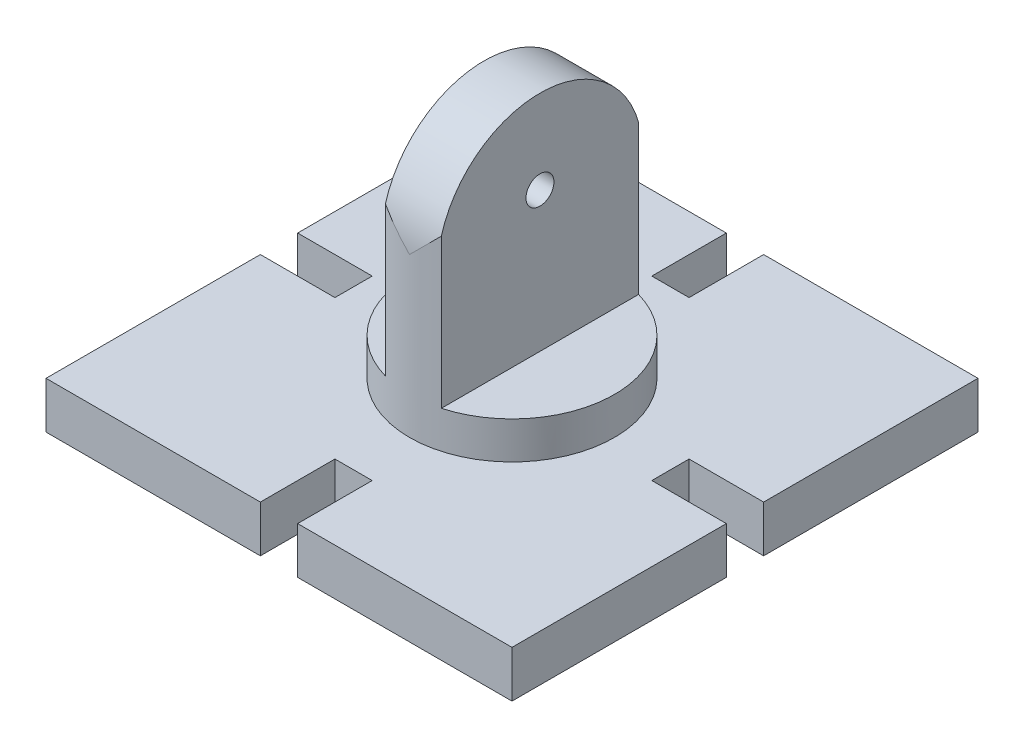
ISO-10303-21;
HEADER;
FILE_DESCRIPTION(('STEP AP214'),'2;1');
FILE_NAME('part.step','',(''),(''),'','','');
FILE_SCHEMA(('AUTOMOTIVE_DESIGN { 1 0 10303 214 1 1 1 1 }'));
ENDSEC;
DATA;
#1=APPLICATION_CONTEXT('core data for automotive mechanical design processes');
#2=APPLICATION_PROTOCOL_DEFINITION('international standard','automotive_design',2000,#1);
#3=PRODUCT_CONTEXT('',#1,'mechanical');
#4=PRODUCT('Part','Part','',(#3));
#5=PRODUCT_RELATED_PRODUCT_CATEGORY('part','',(#4));
#6=PRODUCT_DEFINITION_FORMATION('','',#4);
#7=PRODUCT_DEFINITION_CONTEXT('part definition',#1,'design');
#8=PRODUCT_DEFINITION('design','',#6,#7);
#9=PRODUCT_DEFINITION_SHAPE('','',#8);
#10=(LENGTH_UNIT() NAMED_UNIT(*) SI_UNIT(.MILLI.,.METRE.));
#11=(NAMED_UNIT(*) PLANE_ANGLE_UNIT() SI_UNIT($,.RADIAN.));
#12=(NAMED_UNIT(*) SI_UNIT($,.STERADIAN.) SOLID_ANGLE_UNIT());
#13=UNCERTAINTY_MEASURE_WITH_UNIT(LENGTH_MEASURE(1.E-05),#10,'distance_accuracy_value','');
#14=(GEOMETRIC_REPRESENTATION_CONTEXT(3) GLOBAL_UNCERTAINTY_ASSIGNED_CONTEXT((#13)) GLOBAL_UNIT_ASSIGNED_CONTEXT((#10,
#11,#12)) REPRESENTATION_CONTEXT('',''));
#15=CARTESIAN_POINT('',(0.,0.,0.));
#16=DIRECTION('',(0.,0.,1.));
#17=DIRECTION('',(1.,0.,0.));
#18=AXIS2_PLACEMENT_3D('',#15,#16,#17);
#19=CARTESIAN_POINT('',(-12.5,2.5,-12.5));
#20=DIRECTION('',(1.,0.,0.));
#21=DIRECTION('',(0.,0.,-1.));
#22=AXIS2_PLACEMENT_3D('',#19,#20,#21);
#23=PLANE('',#22);
#24=DIRECTION('',(0.,0.,1.));
#25=VECTOR('',#24,1.);
#26=CARTESIAN_POINT('',(-12.5,2.5,-12.5));
#27=LINE('',#26,#25);
#28=CARTESIAN_POINT('',(-12.5,2.5,1.));
#29=VERTEX_POINT('',#28);
#30=CARTESIAN_POINT('',(-12.5,2.5,12.5));
#31=VERTEX_POINT('',#30);
#32=EDGE_CURVE('E360',#29,#31,#27,.T.);
#33=ORIENTED_EDGE('',*,*,#32,.F.);
#34=DIRECTION('',(0.,-1.,0.));
#35=VECTOR('',#34,1.);
#36=CARTESIAN_POINT('',(-12.5,2.5,0.999999999999999));
#37=LINE('',#36,#35);
#38=CARTESIAN_POINT('',(-12.5,0.,1.));
#39=VERTEX_POINT('',#38);
#40=EDGE_CURVE('E231',#29,#39,#37,.T.);
#41=ORIENTED_EDGE('',*,*,#40,.T.);
#42=DIRECTION('',(0.,0.,1.));
#43=VECTOR('',#42,1.);
#44=CARTESIAN_POINT('',(-12.5,0.,-12.5));
#45=LINE('',#44,#43);
#46=CARTESIAN_POINT('',(-12.5,0.,12.5));
#47=VERTEX_POINT('',#46);
#48=EDGE_CURVE('E385',#39,#47,#45,.T.);
#49=ORIENTED_EDGE('',*,*,#48,.T.);
#50=DIRECTION('',(0.,-1.,0.));
#51=VECTOR('',#50,1.);
#52=CARTESIAN_POINT('',(-12.5,2.5,12.5));
#53=LINE('',#52,#51);
#54=EDGE_CURVE('E364',#31,#47,#53,.T.);
#55=ORIENTED_EDGE('',*,*,#54,.F.);
#56=EDGE_LOOP('',(#33,#41,#49,#55));
#57=FACE_BOUND('',#56,.T.);
#58=ADVANCED_FACE('F35',(#57),#23,.F.);
#59=CARTESIAN_POINT('',(12.5,2.5,-12.5));
#60=DIRECTION('',(-1.,0.,0.));
#61=DIRECTION('',(0.,0.,1.));
#62=AXIS2_PLACEMENT_3D('',#59,#60,#61);
#63=PLANE('',#62);
#64=DIRECTION('',(0.,0.,-1.));
#65=VECTOR('',#64,1.);
#66=CARTESIAN_POINT('',(12.5,0.,-12.5));
#67=LINE('',#66,#65);
#68=CARTESIAN_POINT('',(12.5,0.,12.5));
#69=VERTEX_POINT('',#68);
#70=CARTESIAN_POINT('',(12.5,0.,1.));
#71=VERTEX_POINT('',#70);
#72=EDGE_CURVE('E377',#69,#71,#67,.T.);
#73=ORIENTED_EDGE('',*,*,#72,.T.);
#74=DIRECTION('',(0.,1.,0.));
#75=VECTOR('',#74,1.);
#76=CARTESIAN_POINT('',(12.5,2.5,0.999999999999999));
#77=LINE('',#76,#75);
#78=CARTESIAN_POINT('',(12.5,2.5,1.));
#79=VERTEX_POINT('',#78);
#80=EDGE_CURVE('E247',#71,#79,#77,.T.);
#81=ORIENTED_EDGE('',*,*,#80,.T.);
#82=DIRECTION('',(0.,0.,-1.));
#83=VECTOR('',#82,1.);
#84=CARTESIAN_POINT('',(12.5,2.5,-12.5));
#85=LINE('',#84,#83);
#86=CARTESIAN_POINT('',(12.5,2.5,12.5));
#87=VERTEX_POINT('',#86);
#88=EDGE_CURVE('E416',#87,#79,#85,.T.);
#89=ORIENTED_EDGE('',*,*,#88,.F.);
#90=DIRECTION('',(0.,-1.,0.));
#91=VECTOR('',#90,1.);
#92=CARTESIAN_POINT('',(12.5,2.5,12.5));
#93=LINE('',#92,#91);
#94=EDGE_CURVE('E376',#87,#69,#93,.T.);
#95=ORIENTED_EDGE('',*,*,#94,.T.);
#96=EDGE_LOOP('',(#73,#81,#89,#95));
#97=FACE_BOUND('',#96,.T.);
#98=ADVANCED_FACE('F461',(#97),#63,.F.);
#99=CARTESIAN_POINT('',(-12.5,2.5,12.5));
#100=DIRECTION('',(0.,0.,-1.));
#101=DIRECTION('',(-1.,0.,0.));
#102=AXIS2_PLACEMENT_3D('',#99,#100,#101);
#103=PLANE('',#102);
#104=DIRECTION('',(1.,0.,0.));
#105=VECTOR('',#104,1.);
#106=CARTESIAN_POINT('',(-12.5,2.5,12.5));
#107=LINE('',#106,#105);
#108=CARTESIAN_POINT('',(1.,2.5,12.5));
#109=VERTEX_POINT('',#108);
#110=EDGE_CURVE('E368',#109,#87,#107,.T.);
#111=ORIENTED_EDGE('',*,*,#110,.F.);
#112=DIRECTION('',(0.,-1.,0.));
#113=VECTOR('',#112,1.);
#114=CARTESIAN_POINT('',(0.999999999999999,2.5,12.5));
#115=LINE('',#114,#113);
#116=CARTESIAN_POINT('',(1.,0.,12.5));
#117=VERTEX_POINT('',#116);
#118=EDGE_CURVE('E265',#109,#117,#115,.T.);
#119=ORIENTED_EDGE('',*,*,#118,.T.);
#120=DIRECTION('',(1.,0.,0.));
#121=VECTOR('',#120,1.);
#122=CARTESIAN_POINT('',(-12.5,0.,12.5));
#123=LINE('',#122,#121);
#124=EDGE_CURVE('E388',#117,#69,#123,.T.);
#125=ORIENTED_EDGE('',*,*,#124,.T.);
#126=ORIENTED_EDGE('',*,*,#94,.F.);
#127=EDGE_LOOP('',(#111,#119,#125,#126));
#128=FACE_BOUND('',#127,.T.);
#129=ADVANCED_FACE('F466',(#128),#103,.F.);
#130=CARTESIAN_POINT('',(-12.5,2.5,-12.5));
#131=DIRECTION('',(0.,0.,1.));
#132=DIRECTION('',(1.,0.,0.));
#133=AXIS2_PLACEMENT_3D('',#130,#131,#132);
#134=PLANE('',#133);
#135=DIRECTION('',(-1.,0.,0.));
#136=VECTOR('',#135,1.);
#137=CARTESIAN_POINT('',(-12.5,0.,-12.5));
#138=LINE('',#137,#136);
#139=CARTESIAN_POINT('',(12.5,0.,-12.5));
#140=VERTEX_POINT('',#139);
#141=CARTESIAN_POINT('',(1.,0.,-12.5));
#142=VERTEX_POINT('',#141);
#143=EDGE_CURVE('E382',#140,#142,#138,.T.);
#144=ORIENTED_EDGE('',*,*,#143,.T.);
#145=DIRECTION('',(0.,1.,0.));
#146=VECTOR('',#145,1.);
#147=CARTESIAN_POINT('',(0.999999999999999,2.5,-12.5));
#148=LINE('',#147,#146);
#149=CARTESIAN_POINT('',(1.,2.5,-12.5));
#150=VERTEX_POINT('',#149);
#151=EDGE_CURVE('E283',#142,#150,#148,.T.);
#152=ORIENTED_EDGE('',*,*,#151,.T.);
#153=DIRECTION('',(-1.,0.,0.));
#154=VECTOR('',#153,1.);
#155=CARTESIAN_POINT('',(-12.5,2.5,-12.5));
#156=LINE('',#155,#154);
#157=CARTESIAN_POINT('',(12.5,2.5,-12.5));
#158=VERTEX_POINT('',#157);
#159=EDGE_CURVE('E366',#158,#150,#156,.T.);
#160=ORIENTED_EDGE('',*,*,#159,.F.);
#161=DIRECTION('',(0.,-1.,0.));
#162=VECTOR('',#161,1.);
#163=CARTESIAN_POINT('',(12.5,2.5,-12.5));
#164=LINE('',#163,#162);
#165=EDGE_CURVE('E327',#158,#140,#164,.T.);
#166=ORIENTED_EDGE('',*,*,#165,.T.);
#167=EDGE_LOOP('',(#144,#152,#160,#166));
#168=FACE_BOUND('',#167,.T.);
#169=ADVANCED_FACE('F428',(#168),#134,.F.);
#170=CARTESIAN_POINT('',(0.,4.5,0.));
#171=DIRECTION('',(0.,-1.,0.));
#172=DIRECTION('',(0.,0.,-1.));
#173=AXIS2_PLACEMENT_3D('',#170,#171,#172);
#174=CYLINDRICAL_SURFACE('',#173,5.5);
#175=CARTESIAN_POINT('',(0.,2.5,0.));
#176=DIRECTION('',(0.,1.,0.));
#177=DIRECTION('',(0.,0.,1.));
#178=AXIS2_PLACEMENT_3D('',#175,#176,#177);
#179=CIRCLE('',#178,5.5);
#180=CARTESIAN_POINT('',(0.,2.5,5.5));
#181=VERTEX_POINT('',#180);
#182=EDGE_CURVE('E322',#181,#181,#179,.T.);
#183=ORIENTED_EDGE('',*,*,#182,.T.);
#184=EDGE_LOOP('',(#183));
#185=FACE_BOUND('',#184,.T.);
#186=CARTESIAN_POINT('',(0.,11.,0.));
#187=DIRECTION('',(0.707106781186547,-0.707106781186547,0.));
#188=DIRECTION('',(-0.707106781186547,-0.707106781186547,0.));
#189=AXIS2_PLACEMENT_3D('',#186,#187,#188);
#190=ELLIPSE('',#189,7.77817459305202,5.5);
#191=CARTESIAN_POINT('',(0.,11.,5.5));
#192=VERTEX_POINT('',#191);
#193=CARTESIAN_POINT('',(1.5,12.5,5.29150262212918));
#194=VERTEX_POINT('',#193);
#195=EDGE_CURVE('E292',#192,#194,#190,.F.);
#196=ORIENTED_EDGE('',*,*,#195,.F.);
#197=CARTESIAN_POINT('',(0.,11.,0.));
#198=DIRECTION('',(-0.707106781186547,-0.707106781186547,0.));
#199=DIRECTION('',(0.707106781186547,-0.707106781186547,0.));
#200=AXIS2_PLACEMENT_3D('',#197,#198,#199);
#201=ELLIPSE('',#200,7.77817459305202,5.5);
#202=CARTESIAN_POINT('',(-1.5,12.5,5.29150262212918));
#203=VERTEX_POINT('',#202);
#204=EDGE_CURVE('E288',#203,#192,#201,.F.);
#205=ORIENTED_EDGE('',*,*,#204,.F.);
#206=DIRECTION('',(0.,-1.,0.));
#207=VECTOR('',#206,1.);
#208=CARTESIAN_POINT('',(-1.5,16.5,5.29150262212918));
#209=LINE('',#208,#207);
#210=CARTESIAN_POINT('',(-1.5,4.5,5.29150262212918));
#211=VERTEX_POINT('',#210);
#212=EDGE_CURVE('E314',#203,#211,#209,.T.);
#213=ORIENTED_EDGE('',*,*,#212,.T.);
#214=CARTESIAN_POINT('',(0.,4.5,0.));
#215=DIRECTION('',(0.,1.,0.));
#216=DIRECTION('',(0.,0.,1.));
#217=AXIS2_PLACEMENT_3D('',#214,#215,#216);
#218=CIRCLE('',#217,5.5);
#219=CARTESIAN_POINT('',(-1.5,4.5,-5.29150262212918));
#220=VERTEX_POINT('',#219);
#221=EDGE_CURVE('E307',#220,#211,#218,.T.);
#222=ORIENTED_EDGE('',*,*,#221,.F.);
#223=DIRECTION('',(0.,-1.,0.));
#224=VECTOR('',#223,1.);
#225=CARTESIAN_POINT('',(-1.5,16.5,-5.29150262212918));
#226=LINE('',#225,#224);
#227=CARTESIAN_POINT('',(-1.5,12.5,-5.29150262212918));
#228=VERTEX_POINT('',#227);
#229=EDGE_CURVE('E317',#228,#220,#226,.T.);
#230=ORIENTED_EDGE('',*,*,#229,.F.);
#231=CARTESIAN_POINT('',(0.,11.,-5.5));
#232=VERTEX_POINT('',#231);
#233=EDGE_CURVE('E291',#232,#228,#201,.F.);
#234=ORIENTED_EDGE('',*,*,#233,.F.);
#235=CARTESIAN_POINT('',(1.5,12.5,-5.29150262212918));
#236=VERTEX_POINT('',#235);
#237=EDGE_CURVE('E296',#236,#232,#190,.F.);
#238=ORIENTED_EDGE('',*,*,#237,.F.);
#239=DIRECTION('',(0.,-1.,0.));
#240=VECTOR('',#239,1.);
#241=CARTESIAN_POINT('',(1.5,16.5,-5.29150262212918));
#242=LINE('',#241,#240);
#243=CARTESIAN_POINT('',(1.5,4.5,-5.29150262212918));
#244=VERTEX_POINT('',#243);
#245=EDGE_CURVE('E649',#236,#244,#242,.T.);
#246=ORIENTED_EDGE('',*,*,#245,.T.);
#247=CARTESIAN_POINT('',(1.5,4.5,5.29150262212918));
#248=VERTEX_POINT('',#247);
#249=EDGE_CURVE('E401',#248,#244,#218,.T.);
#250=ORIENTED_EDGE('',*,*,#249,.F.);
#251=DIRECTION('',(0.,-1.,0.));
#252=VECTOR('',#251,1.);
#253=CARTESIAN_POINT('',(1.5,16.5,5.29150262212918));
#254=LINE('',#253,#252);
#255=EDGE_CURVE('E318',#194,#248,#254,.T.);
#256=ORIENTED_EDGE('',*,*,#255,.F.);
#257=EDGE_LOOP('',(#196,#205,#213,#222,#230,#234,#238,#246,#250,#256));
#258=FACE_BOUND('',#257,.T.);
#259=ADVANCED_FACE('F480',(#185,#258),#174,.T.);
#260=CARTESIAN_POINT('',(-1.5,16.5,0.));
#261=DIRECTION('',(1.,0.,0.));
#262=DIRECTION('',(0.,0.,-1.));
#263=AXIS2_PLACEMENT_3D('',#260,#261,#262);
#264=PLANE('',#263);
#265=CARTESIAN_POINT('',(-1.5,12.,0.));
#266=DIRECTION('',(1.,0.,0.));
#267=DIRECTION('',(0.,0.,-1.));
#268=AXIS2_PLACEMENT_3D('',#265,#266,#267);
#269=CIRCLE('',#268,0.75);
#270=CARTESIAN_POINT('',(-1.5,12.,-0.750000000000001));
#271=VERTEX_POINT('',#270);
#272=EDGE_CURVE('E218',#271,#271,#269,.T.);
#273=ORIENTED_EDGE('',*,*,#272,.T.);
#274=EDGE_LOOP('',(#273));
#275=FACE_BOUND('',#274,.T.);
#276=CARTESIAN_POINT('',(-1.5,11.,0.));
#277=DIRECTION('',(1.,0.,0.));
#278=DIRECTION('',(0.,0.,-1.));
#279=AXIS2_PLACEMENT_3D('',#276,#277,#278);
#280=CIRCLE('',#279,5.5);
#281=EDGE_CURVE('E289',#228,#203,#280,.T.);
#282=ORIENTED_EDGE('',*,*,#281,.F.);
#283=ORIENTED_EDGE('',*,*,#229,.T.);
#284=DIRECTION('',(0.,0.,1.));
#285=VECTOR('',#284,1.);
#286=CARTESIAN_POINT('',(-1.5,4.5,0.));
#287=LINE('',#286,#285);
#288=EDGE_CURVE('E302',#220,#211,#287,.T.);
#289=ORIENTED_EDGE('',*,*,#288,.T.);
#290=ORIENTED_EDGE('',*,*,#212,.F.);
#291=EDGE_LOOP('',(#282,#283,#289,#290));
#292=FACE_BOUND('',#291,.T.);
#293=ADVANCED_FACE('F485',(#275,#292),#264,.F.);
#294=CARTESIAN_POINT('',(1.5,16.5,0.));
#295=DIRECTION('',(1.,0.,0.));
#296=DIRECTION('',(0.,0.,-1.));
#297=AXIS2_PLACEMENT_3D('',#294,#295,#296);
#298=PLANE('',#297);
#299=CARTESIAN_POINT('',(1.5,12.,0.));
#300=DIRECTION('',(1.,0.,0.));
#301=DIRECTION('',(0.,0.,-1.));
#302=AXIS2_PLACEMENT_3D('',#299,#300,#301);
#303=CIRCLE('',#302,0.75);
#304=CARTESIAN_POINT('',(1.5,12.,-0.750000000000001));
#305=VERTEX_POINT('',#304);
#306=EDGE_CURVE('E634',#305,#305,#303,.T.);
#307=ORIENTED_EDGE('',*,*,#306,.F.);
#308=EDGE_LOOP('',(#307));
#309=FACE_BOUND('',#308,.T.);
#310=ORIENTED_EDGE('',*,*,#245,.F.);
#311=CARTESIAN_POINT('',(1.5,11.,0.));
#312=DIRECTION('',(1.,0.,0.));
#313=DIRECTION('',(0.,0.,-1.));
#314=AXIS2_PLACEMENT_3D('',#311,#312,#313);
#315=CIRCLE('',#314,5.5);
#316=EDGE_CURVE('E286',#236,#194,#315,.T.);
#317=ORIENTED_EDGE('',*,*,#316,.T.);
#318=ORIENTED_EDGE('',*,*,#255,.T.);
#319=DIRECTION('',(0.,0.,1.));
#320=VECTOR('',#319,1.);
#321=CARTESIAN_POINT('',(1.5,4.5,0.));
#322=LINE('',#321,#320);
#323=EDGE_CURVE('E306',#244,#248,#322,.T.);
#324=ORIENTED_EDGE('',*,*,#323,.F.);
#325=EDGE_LOOP('',(#310,#317,#318,#324));
#326=FACE_BOUND('',#325,.T.);
#327=ADVANCED_FACE('F503',(#309,#326),#298,.T.);
#328=CARTESIAN_POINT('',(0.,4.5,0.));
#329=DIRECTION('',(0.,1.,0.));
#330=DIRECTION('',(0.,0.,1.));
#331=AXIS2_PLACEMENT_3D('',#328,#329,#330);
#332=PLANE('',#331);
#333=ORIENTED_EDGE('',*,*,#249,.T.);
#334=ORIENTED_EDGE('',*,*,#323,.T.);
#335=EDGE_LOOP('',(#333,#334));
#336=FACE_BOUND('',#335,.T.);
#337=ADVANCED_FACE('F496',(#336),#332,.T.);
#338=CARTESIAN_POINT('',(0.,2.5,0.));
#339=DIRECTION('',(0.,1.,0.));
#340=DIRECTION('',(0.,0.,1.));
#341=AXIS2_PLACEMENT_3D('',#338,#339,#340);
#342=PLANE('',#341);
#343=DIRECTION('',(1.,0.,0.));
#344=VECTOR('',#343,1.);
#345=CARTESIAN_POINT('',(-16.5,2.5,1.));
#346=LINE('',#345,#344);
#347=CARTESIAN_POINT('',(-8.5,2.5,1.));
#348=VERTEX_POINT('',#347);
#349=EDGE_CURVE('E209',#29,#348,#346,.T.);
#350=ORIENTED_EDGE('',*,*,#349,.F.);
#351=ORIENTED_EDGE('',*,*,#32,.T.);
#352=CARTESIAN_POINT('',(-1.,2.5,12.5));
#353=VERTEX_POINT('',#352);
#354=EDGE_CURVE('E374',#31,#353,#107,.T.);
#355=ORIENTED_EDGE('',*,*,#354,.T.);
#356=DIRECTION('',(0.,0.,1.));
#357=VECTOR('',#356,1.);
#358=CARTESIAN_POINT('',(-1.,2.5,16.5));
#359=LINE('',#358,#357);
#360=CARTESIAN_POINT('',(-1.,2.5,8.5));
#361=VERTEX_POINT('',#360);
#362=EDGE_CURVE('E255',#361,#353,#359,.T.);
#363=ORIENTED_EDGE('',*,*,#362,.F.);
#364=DIRECTION('',(-1.,0.,0.));
#365=VECTOR('',#364,1.);
#366=CARTESIAN_POINT('',(-1.,2.5,8.5));
#367=LINE('',#366,#365);
#368=CARTESIAN_POINT('',(1.,2.5,8.5));
#369=VERTEX_POINT('',#368);
#370=EDGE_CURVE('E252',#369,#361,#367,.T.);
#371=ORIENTED_EDGE('',*,*,#370,.F.);
#372=DIRECTION('',(0.,0.,-1.));
#373=VECTOR('',#372,1.);
#374=CARTESIAN_POINT('',(1.,2.5,16.5));
#375=LINE('',#374,#373);
#376=EDGE_CURVE('E250',#109,#369,#375,.T.);
#377=ORIENTED_EDGE('',*,*,#376,.F.);
#378=ORIENTED_EDGE('',*,*,#110,.T.);
#379=ORIENTED_EDGE('',*,*,#88,.T.);
#380=DIRECTION('',(1.,0.,0.));
#381=VECTOR('',#380,1.);
#382=CARTESIAN_POINT('',(8.5,2.5,1.));
#383=LINE('',#382,#381);
#384=CARTESIAN_POINT('',(8.5,2.5,1.));
#385=VERTEX_POINT('',#384);
#386=EDGE_CURVE('E239',#385,#79,#383,.T.);
#387=ORIENTED_EDGE('',*,*,#386,.F.);
#388=DIRECTION('',(0.,0.,1.));
#389=VECTOR('',#388,1.);
#390=CARTESIAN_POINT('',(8.5,2.5,-1.));
#391=LINE('',#390,#389);
#392=CARTESIAN_POINT('',(8.5,2.5,-1.));
#393=VERTEX_POINT('',#392);
#394=EDGE_CURVE('E236',#393,#385,#391,.T.);
#395=ORIENTED_EDGE('',*,*,#394,.F.);
#396=DIRECTION('',(-1.,0.,0.));
#397=VECTOR('',#396,1.);
#398=CARTESIAN_POINT('',(8.5,2.5,-1.));
#399=LINE('',#398,#397);
#400=CARTESIAN_POINT('',(12.5,2.5,-1.));
#401=VERTEX_POINT('',#400);
#402=EDGE_CURVE('E234',#401,#393,#399,.T.);
#403=ORIENTED_EDGE('',*,*,#402,.F.);
#404=EDGE_CURVE('E392',#401,#158,#85,.T.);
#405=ORIENTED_EDGE('',*,*,#404,.T.);
#406=ORIENTED_EDGE('',*,*,#159,.T.);
#407=DIRECTION('',(0.,0.,-1.));
#408=VECTOR('',#407,1.);
#409=CARTESIAN_POINT('',(1.,2.5,-16.5));
#410=LINE('',#409,#408);
#411=CARTESIAN_POINT('',(1.,2.5,-8.5));
#412=VERTEX_POINT('',#411);
#413=EDGE_CURVE('E268',#412,#150,#410,.T.);
#414=ORIENTED_EDGE('',*,*,#413,.F.);
#415=DIRECTION('',(1.,0.,0.));
#416=VECTOR('',#415,1.);
#417=CARTESIAN_POINT('',(-0.999999999999999,2.5,-8.5));
#418=LINE('',#417,#416);
#419=CARTESIAN_POINT('',(-0.999999999999999,2.5,-8.5));
#420=VERTEX_POINT('',#419);
#421=EDGE_CURVE('E273',#420,#412,#418,.T.);
#422=ORIENTED_EDGE('',*,*,#421,.F.);
#423=DIRECTION('',(0.,0.,1.));
#424=VECTOR('',#423,1.);
#425=CARTESIAN_POINT('',(-1.,2.5,-16.5));
#426=LINE('',#425,#424);
#427=CARTESIAN_POINT('',(-1.,2.5,-12.5));
#428=VERTEX_POINT('',#427);
#429=EDGE_CURVE('E270',#428,#420,#426,.T.);
#430=ORIENTED_EDGE('',*,*,#429,.F.);
#431=CARTESIAN_POINT('',(-12.5,2.5,-12.5));
#432=VERTEX_POINT('',#431);
#433=EDGE_CURVE('E370',#428,#432,#156,.T.);
#434=ORIENTED_EDGE('',*,*,#433,.T.);
#435=CARTESIAN_POINT('',(-12.5,2.5,-1.));
#436=VERTEX_POINT('',#435);
#437=EDGE_CURVE('E224',#432,#436,#27,.T.);
#438=ORIENTED_EDGE('',*,*,#437,.T.);
#439=DIRECTION('',(-1.,0.,0.));
#440=VECTOR('',#439,1.);
#441=CARTESIAN_POINT('',(-16.5,2.5,-1.));
#442=LINE('',#441,#440);
#443=CARTESIAN_POINT('',(-8.5,2.5,-1.));
#444=VERTEX_POINT('',#443);
#445=EDGE_CURVE('E204',#444,#436,#442,.T.);
#446=ORIENTED_EDGE('',*,*,#445,.F.);
#447=DIRECTION('',(0.,0.,-1.));
#448=VECTOR('',#447,1.);
#449=CARTESIAN_POINT('',(-8.5,2.5,-1.));
#450=LINE('',#449,#448);
#451=EDGE_CURVE('E212',#348,#444,#450,.T.);
#452=ORIENTED_EDGE('',*,*,#451,.F.);
#453=EDGE_LOOP('',(#350,#351,#355,#363,#371,#377,#378,#379,#387,#395,#403,#405,#406,#414,#422,
#430,#434,#438,#446,#452));
#454=FACE_BOUND('',#453,.T.);
#455=ORIENTED_EDGE('',*,*,#182,.F.);
#456=EDGE_LOOP('',(#455));
#457=FACE_BOUND('',#456,.T.);
#458=ADVANCED_FACE('F221',(#454,#457),#342,.T.);
#459=ORIENTED_EDGE('',*,*,#404,.F.);
#460=DIRECTION('',(0.,-1.,0.));
#461=VECTOR('',#460,1.);
#462=CARTESIAN_POINT('',(12.5,2.5,-0.999999999999999));
#463=LINE('',#462,#461);
#464=CARTESIAN_POINT('',(12.5,0.,-1.));
#465=VERTEX_POINT('',#464);
#466=EDGE_CURVE('E243',#401,#465,#463,.T.);
#467=ORIENTED_EDGE('',*,*,#466,.T.);
#468=EDGE_CURVE('E381',#465,#140,#67,.T.);
#469=ORIENTED_EDGE('',*,*,#468,.T.);
#470=ORIENTED_EDGE('',*,*,#165,.F.);
#471=EDGE_LOOP('',(#459,#467,#469,#470));
#472=FACE_BOUND('',#471,.T.);
#473=ADVANCED_FACE('F37',(#472),#63,.F.);
#474=ORIENTED_EDGE('',*,*,#433,.F.);
#475=DIRECTION('',(0.,-1.,0.));
#476=VECTOR('',#475,1.);
#477=CARTESIAN_POINT('',(-0.999999999999999,2.5,-12.5));
#478=LINE('',#477,#476);
#479=CARTESIAN_POINT('',(-1.,0.,-12.5));
#480=VERTEX_POINT('',#479);
#481=EDGE_CURVE('E279',#428,#480,#478,.T.);
#482=ORIENTED_EDGE('',*,*,#481,.T.);
#483=CARTESIAN_POINT('',(-12.5,0.,-12.5));
#484=VERTEX_POINT('',#483);
#485=EDGE_CURVE('E380',#480,#484,#138,.T.);
#486=ORIENTED_EDGE('',*,*,#485,.T.);
#487=DIRECTION('',(0.,-1.,0.));
#488=VECTOR('',#487,1.);
#489=CARTESIAN_POINT('',(-12.5,2.5,-12.5));
#490=LINE('',#489,#488);
#491=EDGE_CURVE('E396',#432,#484,#490,.T.);
#492=ORIENTED_EDGE('',*,*,#491,.F.);
#493=EDGE_LOOP('',(#474,#482,#486,#492));
#494=FACE_BOUND('',#493,.T.);
#495=ADVANCED_FACE('F443',(#494),#134,.F.);
#496=CARTESIAN_POINT('',(-12.5,0.,-0.999999999999999));
#497=VERTEX_POINT('',#496);
#498=EDGE_CURVE('E386',#484,#497,#45,.T.);
#499=ORIENTED_EDGE('',*,*,#498,.T.);
#500=DIRECTION('',(0.,1.,0.));
#501=VECTOR('',#500,1.);
#502=CARTESIAN_POINT('',(-12.5,2.5,-0.999999999999999));
#503=LINE('',#502,#501);
#504=EDGE_CURVE('E50',#497,#436,#503,.T.);
#505=ORIENTED_EDGE('',*,*,#504,.T.);
#506=ORIENTED_EDGE('',*,*,#437,.F.);
#507=ORIENTED_EDGE('',*,*,#491,.T.);
#508=EDGE_LOOP('',(#499,#505,#506,#507));
#509=FACE_BOUND('',#508,.T.);
#510=ADVANCED_FACE('F446',(#509),#23,.F.);
#511=CARTESIAN_POINT('',(-1.,0.,12.5));
#512=VERTEX_POINT('',#511);
#513=EDGE_CURVE('E389',#47,#512,#123,.T.);
#514=ORIENTED_EDGE('',*,*,#513,.T.);
#515=DIRECTION('',(0.,1.,0.));
#516=VECTOR('',#515,1.);
#517=CARTESIAN_POINT('',(-0.999999999999999,2.5,12.5));
#518=LINE('',#517,#516);
#519=EDGE_CURVE('E260',#512,#353,#518,.T.);
#520=ORIENTED_EDGE('',*,*,#519,.T.);
#521=ORIENTED_EDGE('',*,*,#354,.F.);
#522=ORIENTED_EDGE('',*,*,#54,.T.);
#523=EDGE_LOOP('',(#514,#520,#521,#522));
#524=FACE_BOUND('',#523,.T.);
#525=ADVANCED_FACE('F470',(#524),#103,.F.);
#526=CARTESIAN_POINT('',(0.,0.,0.));
#527=DIRECTION('',(0.,1.,0.));
#528=DIRECTION('',(0.,0.,1.));
#529=AXIS2_PLACEMENT_3D('',#526,#527,#528);
#530=PLANE('',#529);
#531=ORIENTED_EDGE('',*,*,#48,.F.);
#532=DIRECTION('',(1.,0.,0.));
#533=VECTOR('',#532,1.);
#534=CARTESIAN_POINT('',(0.,0.,1.));
#535=LINE('',#534,#533);
#536=CARTESIAN_POINT('',(-8.5,0.,1.));
#537=VERTEX_POINT('',#536);
#538=EDGE_CURVE('E11',#39,#537,#535,.T.);
#539=ORIENTED_EDGE('',*,*,#538,.T.);
#540=DIRECTION('',(0.,0.,-1.));
#541=VECTOR('',#540,1.);
#542=CARTESIAN_POINT('',(-8.5,0.,0.));
#543=LINE('',#542,#541);
#544=CARTESIAN_POINT('',(-8.5,0.,-1.));
#545=VERTEX_POINT('',#544);
#546=EDGE_CURVE('E43',#537,#545,#543,.T.);
#547=ORIENTED_EDGE('',*,*,#546,.T.);
#548=DIRECTION('',(-1.,0.,0.));
#549=VECTOR('',#548,1.);
#550=CARTESIAN_POINT('',(0.,0.,-1.));
#551=LINE('',#550,#549);
#552=EDGE_CURVE('E205',#545,#497,#551,.T.);
#553=ORIENTED_EDGE('',*,*,#552,.T.);
#554=ORIENTED_EDGE('',*,*,#498,.F.);
#555=ORIENTED_EDGE('',*,*,#485,.F.);
#556=DIRECTION('',(0.,0.,1.));
#557=VECTOR('',#556,1.);
#558=CARTESIAN_POINT('',(-0.999999999999998,0.,0.));
#559=LINE('',#558,#557);
#560=CARTESIAN_POINT('',(-0.999999999999999,0.,-8.5));
#561=VERTEX_POINT('',#560);
#562=EDGE_CURVE('E323',#480,#561,#559,.T.);
#563=ORIENTED_EDGE('',*,*,#562,.T.);
#564=DIRECTION('',(1.,0.,0.));
#565=VECTOR('',#564,1.);
#566=CARTESIAN_POINT('',(0.,0.,-8.5));
#567=LINE('',#566,#565);
#568=CARTESIAN_POINT('',(1.,0.,-8.5));
#569=VERTEX_POINT('',#568);
#570=EDGE_CURVE('E326',#561,#569,#567,.T.);
#571=ORIENTED_EDGE('',*,*,#570,.T.);
#572=DIRECTION('',(0.,0.,-1.));
#573=VECTOR('',#572,1.);
#574=CARTESIAN_POINT('',(1.,0.,0.));
#575=LINE('',#574,#573);
#576=EDGE_CURVE('E330',#569,#142,#575,.T.);
#577=ORIENTED_EDGE('',*,*,#576,.T.);
#578=ORIENTED_EDGE('',*,*,#143,.F.);
#579=ORIENTED_EDGE('',*,*,#468,.F.);
#580=DIRECTION('',(-1.,0.,0.));
#581=VECTOR('',#580,1.);
#582=CARTESIAN_POINT('',(0.,0.,-1.));
#583=LINE('',#582,#581);
#584=CARTESIAN_POINT('',(8.5,0.,-1.));
#585=VERTEX_POINT('',#584);
#586=EDGE_CURVE('E342',#465,#585,#583,.T.);
#587=ORIENTED_EDGE('',*,*,#586,.T.);
#588=DIRECTION('',(0.,0.,1.));
#589=VECTOR('',#588,1.);
#590=CARTESIAN_POINT('',(8.5,0.,0.));
#591=LINE('',#590,#589);
#592=CARTESIAN_POINT('',(8.5,0.,1.));
#593=VERTEX_POINT('',#592);
#594=EDGE_CURVE('E345',#585,#593,#591,.T.);
#595=ORIENTED_EDGE('',*,*,#594,.T.);
#596=DIRECTION('',(1.,0.,0.));
#597=VECTOR('',#596,1.);
#598=CARTESIAN_POINT('',(0.,0.,1.));
#599=LINE('',#598,#597);
#600=EDGE_CURVE('E348',#593,#71,#599,.T.);
#601=ORIENTED_EDGE('',*,*,#600,.T.);
#602=ORIENTED_EDGE('',*,*,#72,.F.);
#603=ORIENTED_EDGE('',*,*,#124,.F.);
#604=DIRECTION('',(0.,0.,-1.));
#605=VECTOR('',#604,1.);
#606=CARTESIAN_POINT('',(1.,0.,0.));
#607=LINE('',#606,#605);
#608=CARTESIAN_POINT('',(1.,0.,8.5));
#609=VERTEX_POINT('',#608);
#610=EDGE_CURVE('E339',#117,#609,#607,.T.);
#611=ORIENTED_EDGE('',*,*,#610,.T.);
#612=DIRECTION('',(-1.,0.,0.));
#613=VECTOR('',#612,1.);
#614=CARTESIAN_POINT('',(0.,0.,8.5));
#615=LINE('',#614,#613);
#616=CARTESIAN_POINT('',(-1.,0.,8.5));
#617=VERTEX_POINT('',#616);
#618=EDGE_CURVE('E333',#609,#617,#615,.T.);
#619=ORIENTED_EDGE('',*,*,#618,.T.);
#620=DIRECTION('',(0.,0.,1.));
#621=VECTOR('',#620,1.);
#622=CARTESIAN_POINT('',(-1.,0.,0.));
#623=LINE('',#622,#621);
#624=EDGE_CURVE('E336',#617,#512,#623,.T.);
#625=ORIENTED_EDGE('',*,*,#624,.T.);
#626=ORIENTED_EDGE('',*,*,#513,.F.);
#627=EDGE_LOOP('',(#531,#539,#547,#553,#554,#555,#563,#571,#577,#578,#579,#587,#595,#601,#602,
#603,#611,#619,#625,#626));
#628=FACE_BOUND('',#627,.T.);
#629=ADVANCED_FACE('F353',(#628),#530,.F.);
#630=ORIENTED_EDGE('',*,*,#288,.F.);
#631=ORIENTED_EDGE('',*,*,#221,.T.);
#632=EDGE_LOOP('',(#630,#631));
#633=FACE_BOUND('',#632,.T.);
#634=ADVANCED_FACE('F494',(#633),#332,.T.);
#635=CARTESIAN_POINT('',(-13.5,11.,0.));
#636=DIRECTION('',(1.,0.,0.));
#637=DIRECTION('',(0.,0.,-1.));
#638=AXIS2_PLACEMENT_3D('',#635,#636,#637);
#639=CYLINDRICAL_SURFACE('',#638,5.5);
#640=ORIENTED_EDGE('',*,*,#237,.T.);
#641=ORIENTED_EDGE('',*,*,#233,.T.);
#642=ORIENTED_EDGE('',*,*,#281,.T.);
#643=ORIENTED_EDGE('',*,*,#204,.T.);
#644=ORIENTED_EDGE('',*,*,#195,.T.);
#645=ORIENTED_EDGE('',*,*,#316,.F.);
#646=EDGE_LOOP('',(#640,#641,#642,#643,#644,#645));
#647=FACE_BOUND('',#646,.T.);
#648=ADVANCED_FACE('F500',(#647),#639,.T.);
#649=CARTESIAN_POINT('',(1.,-12.5,-16.5));
#650=DIRECTION('',(1.,0.,0.));
#651=DIRECTION('',(0.,0.,-1.));
#652=AXIS2_PLACEMENT_3D('',#649,#650,#651);
#653=PLANE('',#652);
#654=ORIENTED_EDGE('',*,*,#576,.F.);
#655=DIRECTION('',(0.,1.,0.));
#656=VECTOR('',#655,1.);
#657=CARTESIAN_POINT('',(1.,-12.5,-8.5));
#658=LINE('',#657,#656);
#659=EDGE_CURVE('E277',#569,#412,#658,.T.);
#660=ORIENTED_EDGE('',*,*,#659,.T.);
#661=ORIENTED_EDGE('',*,*,#413,.T.);
#662=ORIENTED_EDGE('',*,*,#151,.F.);
#663=EDGE_LOOP('',(#654,#660,#661,#662));
#664=FACE_BOUND('',#663,.T.);
#665=ADVANCED_FACE('F434',(#664),#653,.F.);
#666=CARTESIAN_POINT('',(-0.999999999999999,-12.5,-8.5));
#667=DIRECTION('',(0.,0.,1.));
#668=DIRECTION('',(1.,0.,0.));
#669=AXIS2_PLACEMENT_3D('',#666,#667,#668);
#670=PLANE('',#669);
#671=DIRECTION('',(0.,1.,0.));
#672=VECTOR('',#671,1.);
#673=CARTESIAN_POINT('',(-0.999999999999999,-12.5,-8.5));
#674=LINE('',#673,#672);
#675=EDGE_CURVE('E276',#561,#420,#674,.T.);
#676=ORIENTED_EDGE('',*,*,#675,.T.);
#677=ORIENTED_EDGE('',*,*,#421,.T.);
#678=ORIENTED_EDGE('',*,*,#659,.F.);
#679=ORIENTED_EDGE('',*,*,#570,.F.);
#680=EDGE_LOOP('',(#676,#677,#678,#679));
#681=FACE_BOUND('',#680,.T.);
#682=ADVANCED_FACE('F436',(#681),#670,.F.);
#683=CARTESIAN_POINT('',(-1.,-12.5,-16.5));
#684=DIRECTION('',(-1.,0.,0.));
#685=DIRECTION('',(0.,0.,1.));
#686=AXIS2_PLACEMENT_3D('',#683,#684,#685);
#687=PLANE('',#686);
#688=ORIENTED_EDGE('',*,*,#429,.T.);
#689=ORIENTED_EDGE('',*,*,#675,.F.);
#690=ORIENTED_EDGE('',*,*,#562,.F.);
#691=ORIENTED_EDGE('',*,*,#481,.F.);
#692=EDGE_LOOP('',(#688,#689,#690,#691));
#693=FACE_BOUND('',#692,.T.);
#694=ADVANCED_FACE('F447',(#693),#687,.F.);
#695=CARTESIAN_POINT('',(1.,-12.5,16.5));
#696=DIRECTION('',(1.,0.,0.));
#697=DIRECTION('',(0.,0.,-1.));
#698=AXIS2_PLACEMENT_3D('',#695,#696,#697);
#699=PLANE('',#698);
#700=ORIENTED_EDGE('',*,*,#376,.T.);
#701=DIRECTION('',(0.,1.,0.));
#702=VECTOR('',#701,1.);
#703=CARTESIAN_POINT('',(1.,-12.5,8.5));
#704=LINE('',#703,#702);
#705=EDGE_CURVE('E257',#609,#369,#704,.T.);
#706=ORIENTED_EDGE('',*,*,#705,.F.);
#707=ORIENTED_EDGE('',*,*,#610,.F.);
#708=ORIENTED_EDGE('',*,*,#118,.F.);
#709=EDGE_LOOP('',(#700,#706,#707,#708));
#710=FACE_BOUND('',#709,.T.);
#711=ADVANCED_FACE('F449',(#710),#699,.F.);
#712=CARTESIAN_POINT('',(-1.,-12.5,16.5));
#713=DIRECTION('',(-1.,0.,0.));
#714=DIRECTION('',(0.,0.,1.));
#715=AXIS2_PLACEMENT_3D('',#712,#713,#714);
#716=PLANE('',#715);
#717=ORIENTED_EDGE('',*,*,#624,.F.);
#718=DIRECTION('',(0.,1.,0.));
#719=VECTOR('',#718,1.);
#720=CARTESIAN_POINT('',(-1.,-12.5,8.5));
#721=LINE('',#720,#719);
#722=EDGE_CURVE('E258',#617,#361,#721,.T.);
#723=ORIENTED_EDGE('',*,*,#722,.T.);
#724=ORIENTED_EDGE('',*,*,#362,.T.);
#725=ORIENTED_EDGE('',*,*,#519,.F.);
#726=EDGE_LOOP('',(#717,#723,#724,#725));
#727=FACE_BOUND('',#726,.T.);
#728=ADVANCED_FACE('F455',(#727),#716,.F.);
#729=CARTESIAN_POINT('',(-1.,-12.5,8.5));
#730=DIRECTION('',(0.,0.,-1.));
#731=DIRECTION('',(-1.,0.,0.));
#732=AXIS2_PLACEMENT_3D('',#729,#730,#731);
#733=PLANE('',#732);
#734=ORIENTED_EDGE('',*,*,#705,.T.);
#735=ORIENTED_EDGE('',*,*,#370,.T.);
#736=ORIENTED_EDGE('',*,*,#722,.F.);
#737=ORIENTED_EDGE('',*,*,#618,.F.);
#738=EDGE_LOOP('',(#734,#735,#736,#737));
#739=FACE_BOUND('',#738,.T.);
#740=ADVANCED_FACE('F539',(#739),#733,.F.);
#741=CARTESIAN_POINT('',(8.5,-12.5,1.));
#742=DIRECTION('',(0.,0.,1.));
#743=DIRECTION('',(1.,0.,0.));
#744=AXIS2_PLACEMENT_3D('',#741,#742,#743);
#745=PLANE('',#744);
#746=ORIENTED_EDGE('',*,*,#600,.F.);
#747=DIRECTION('',(0.,1.,0.));
#748=VECTOR('',#747,1.);
#749=CARTESIAN_POINT('',(8.5,-12.5,1.));
#750=LINE('',#749,#748);
#751=EDGE_CURVE('E241',#593,#385,#750,.T.);
#752=ORIENTED_EDGE('',*,*,#751,.T.);
#753=ORIENTED_EDGE('',*,*,#386,.T.);
#754=ORIENTED_EDGE('',*,*,#80,.F.);
#755=EDGE_LOOP('',(#746,#752,#753,#754));
#756=FACE_BOUND('',#755,.T.);
#757=ADVANCED_FACE('F549',(#756),#745,.F.);
#758=CARTESIAN_POINT('',(8.5,-12.5,-1.));
#759=DIRECTION('',(-1.,0.,0.));
#760=DIRECTION('',(0.,0.,1.));
#761=AXIS2_PLACEMENT_3D('',#758,#759,#760);
#762=PLANE('',#761);
#763=DIRECTION('',(0.,1.,0.));
#764=VECTOR('',#763,1.);
#765=CARTESIAN_POINT('',(8.5,-12.5,-1.));
#766=LINE('',#765,#764);
#767=EDGE_CURVE('E58',#585,#393,#766,.T.);
#768=ORIENTED_EDGE('',*,*,#767,.T.);
#769=ORIENTED_EDGE('',*,*,#394,.T.);
#770=ORIENTED_EDGE('',*,*,#751,.F.);
#771=ORIENTED_EDGE('',*,*,#594,.F.);
#772=EDGE_LOOP('',(#768,#769,#770,#771));
#773=FACE_BOUND('',#772,.T.);
#774=ADVANCED_FACE('F559',(#773),#762,.F.);
#775=CARTESIAN_POINT('',(8.5,-12.5,-1.));
#776=DIRECTION('',(0.,0.,-1.));
#777=DIRECTION('',(-1.,0.,0.));
#778=AXIS2_PLACEMENT_3D('',#775,#776,#777);
#779=PLANE('',#778);
#780=ORIENTED_EDGE('',*,*,#402,.T.);
#781=ORIENTED_EDGE('',*,*,#767,.F.);
#782=ORIENTED_EDGE('',*,*,#586,.F.);
#783=ORIENTED_EDGE('',*,*,#466,.F.);
#784=EDGE_LOOP('',(#780,#781,#782,#783));
#785=FACE_BOUND('',#784,.T.);
#786=ADVANCED_FACE('F569',(#785),#779,.F.);
#787=CARTESIAN_POINT('',(-8.5,-12.5,-1.));
#788=DIRECTION('',(1.,0.,0.));
#789=DIRECTION('',(0.,0.,-1.));
#790=AXIS2_PLACEMENT_3D('',#787,#788,#789);
#791=PLANE('',#790);
#792=DIRECTION('',(0.,1.,0.));
#793=VECTOR('',#792,1.);
#794=CARTESIAN_POINT('',(-8.5,-12.5,1.));
#795=LINE('',#794,#793);
#796=EDGE_CURVE('E208',#537,#348,#795,.T.);
#797=ORIENTED_EDGE('',*,*,#796,.T.);
#798=ORIENTED_EDGE('',*,*,#451,.T.);
#799=DIRECTION('',(0.,1.,0.));
#800=VECTOR('',#799,1.);
#801=CARTESIAN_POINT('',(-8.5,-12.5,-1.));
#802=LINE('',#801,#800);
#803=EDGE_CURVE('E200',#545,#444,#802,.T.);
#804=ORIENTED_EDGE('',*,*,#803,.F.);
#805=ORIENTED_EDGE('',*,*,#546,.F.);
#806=EDGE_LOOP('',(#797,#798,#804,#805));
#807=FACE_BOUND('',#806,.T.);
#808=ADVANCED_FACE('F213',(#807),#791,.F.);
#809=CARTESIAN_POINT('',(-16.5,-12.5,1.));
#810=DIRECTION('',(0.,0.,1.));
#811=DIRECTION('',(1.,0.,0.));
#812=AXIS2_PLACEMENT_3D('',#809,#810,#811);
#813=PLANE('',#812);
#814=ORIENTED_EDGE('',*,*,#349,.T.);
#815=ORIENTED_EDGE('',*,*,#796,.F.);
#816=ORIENTED_EDGE('',*,*,#538,.F.);
#817=ORIENTED_EDGE('',*,*,#40,.F.);
#818=EDGE_LOOP('',(#814,#815,#816,#817));
#819=FACE_BOUND('',#818,.T.);
#820=ADVANCED_FACE('F357',(#819),#813,.F.);
#821=CARTESIAN_POINT('',(-16.5,-12.5,-1.));
#822=DIRECTION('',(0.,0.,-1.));
#823=DIRECTION('',(-1.,0.,0.));
#824=AXIS2_PLACEMENT_3D('',#821,#822,#823);
#825=PLANE('',#824);
#826=ORIENTED_EDGE('',*,*,#552,.F.);
#827=ORIENTED_EDGE('',*,*,#803,.T.);
#828=ORIENTED_EDGE('',*,*,#445,.T.);
#829=ORIENTED_EDGE('',*,*,#504,.F.);
#830=EDGE_LOOP('',(#826,#827,#828,#829));
#831=FACE_BOUND('',#830,.T.);
#832=ADVANCED_FACE('F202',(#831),#825,.F.);
#833=CARTESIAN_POINT('',(-8.5,12.,0.));
#834=DIRECTION('',(1.,0.,0.));
#835=DIRECTION('',(0.,0.,-1.));
#836=AXIS2_PLACEMENT_3D('',#833,#834,#835);
#837=CYLINDRICAL_SURFACE('',#836,0.75);
#838=ORIENTED_EDGE('',*,*,#306,.T.);
#839=EDGE_LOOP('',(#838));
#840=FACE_BOUND('',#839,.T.);
#841=ORIENTED_EDGE('',*,*,#272,.F.);
#842=EDGE_LOOP('',(#841));
#843=FACE_BOUND('',#842,.T.);
#844=ADVANCED_FACE('F603',(#840,#843),#837,.F.);
#845=CLOSED_SHELL('',(#58,#98,#129,#169,#259,#293,#327,#337,#458,#473,#495,#510,#525,#629,#634,
#648,#665,#682,#694,#711,#728,#740,#757,#774,#786,#808,#820,#832,#844));
#846=MANIFOLD_SOLID_BREP('B2',#845);
#847=ADVANCED_BREP_SHAPE_REPRESENTATION('',(#18,#846),#14);
#848=SHAPE_DEFINITION_REPRESENTATION(#9,#847);
ENDSEC;
END-ISO-10303-21;
